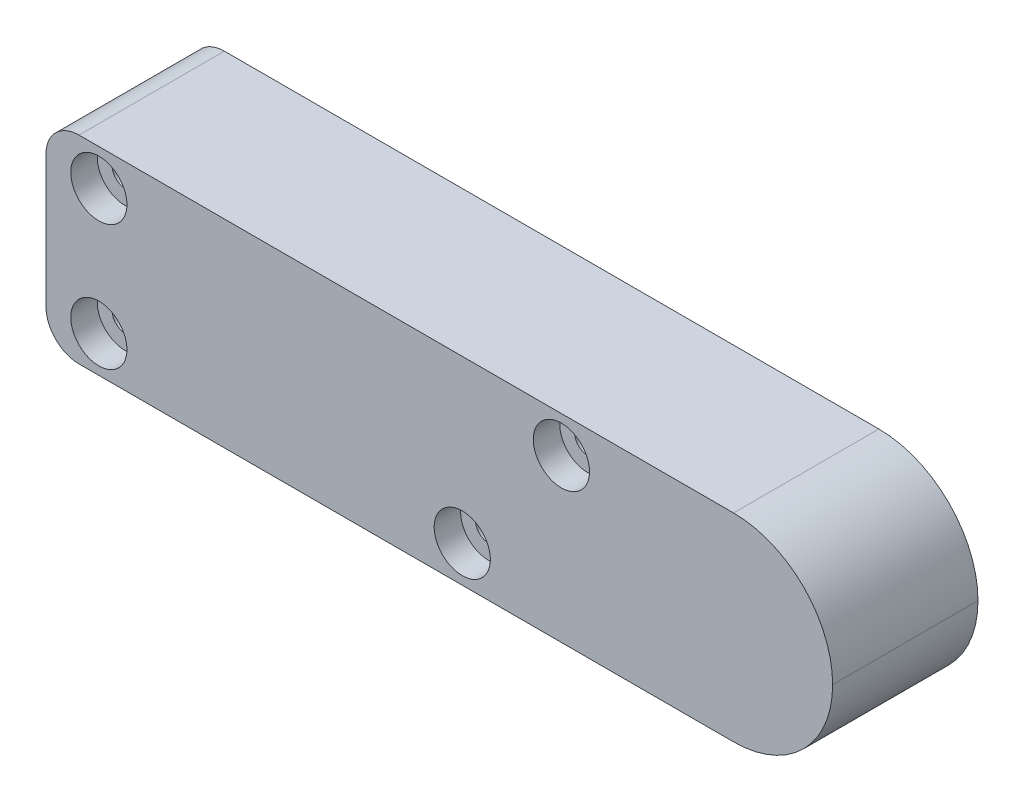
ISO-10303-21;
HEADER;
FILE_DESCRIPTION(('STEP AP214'),'2;1');
FILE_NAME('part.step','',(''),(''),'','','');
FILE_SCHEMA(('AUTOMOTIVE_DESIGN { 1 0 10303 214 1 1 1 1 }'));
ENDSEC;
DATA;
#1=APPLICATION_CONTEXT('core data for automotive mechanical design processes');
#2=APPLICATION_PROTOCOL_DEFINITION('international standard','automotive_design',2000,#1);
#3=PRODUCT_CONTEXT('',#1,'mechanical');
#4=PRODUCT('Part','Part','',(#3));
#5=PRODUCT_RELATED_PRODUCT_CATEGORY('part','',(#4));
#6=PRODUCT_DEFINITION_FORMATION('','',#4);
#7=PRODUCT_DEFINITION_CONTEXT('part definition',#1,'design');
#8=PRODUCT_DEFINITION('design','',#6,#7);
#9=PRODUCT_DEFINITION_SHAPE('','',#8);
#10=(LENGTH_UNIT() NAMED_UNIT(*) SI_UNIT(.MILLI.,.METRE.));
#11=(NAMED_UNIT(*) PLANE_ANGLE_UNIT() SI_UNIT($,.RADIAN.));
#12=(NAMED_UNIT(*) SI_UNIT($,.STERADIAN.) SOLID_ANGLE_UNIT());
#13=UNCERTAINTY_MEASURE_WITH_UNIT(LENGTH_MEASURE(1.E-05),#10,'distance_accuracy_value','');
#14=(GEOMETRIC_REPRESENTATION_CONTEXT(3) GLOBAL_UNCERTAINTY_ASSIGNED_CONTEXT((#13)) GLOBAL_UNIT_ASSIGNED_CONTEXT((#10,
#11,#12)) REPRESENTATION_CONTEXT('',''));
#15=CARTESIAN_POINT('',(0.,0.,0.));
#16=DIRECTION('',(0.,0.,1.));
#17=DIRECTION('',(1.,0.,0.));
#18=AXIS2_PLACEMENT_3D('',#15,#16,#17);
#19=CARTESIAN_POINT('',(-6.99999999999998,-6.93369842754066,41.));
#20=DIRECTION('',(0.,0.,-1.));
#21=DIRECTION('',(-1.,0.,0.));
#22=AXIS2_PLACEMENT_3D('',#19,#20,#21);
#23=CYLINDRICAL_SURFACE('',#22,2.);
#24=CARTESIAN_POINT('',(-6.99999999999998,-6.93369842754066,16.));
#25=DIRECTION('',(0.,0.,-1.));
#26=DIRECTION('',(-1.,0.,0.));
#27=AXIS2_PLACEMENT_3D('',#24,#25,#26);
#28=CIRCLE('',#27,2.);
#29=CARTESIAN_POINT('',(-8.99999999999998,-6.93369842754066,16.));
#30=VERTEX_POINT('',#29);
#31=EDGE_CURVE('E223',#30,#30,#28,.T.);
#32=ORIENTED_EDGE('',*,*,#31,.T.);
#33=EDGE_LOOP('',(#32));
#34=FACE_BOUND('',#33,.T.);
#35=CARTESIAN_POINT('',(-6.99999999999998,-6.93369842754066,34.));
#36=DIRECTION('',(0.,0.,1.));
#37=DIRECTION('',(1.,0.,0.));
#38=AXIS2_PLACEMENT_3D('',#35,#36,#37);
#39=CIRCLE('',#38,2.);
#40=CARTESIAN_POINT('',(-4.99999999999998,-6.93369842754066,34.));
#41=VERTEX_POINT('',#40);
#42=EDGE_CURVE('E235',#41,#41,#39,.F.);
#43=ORIENTED_EDGE('',*,*,#42,.F.);
#44=EDGE_LOOP('',(#43));
#45=FACE_BOUND('',#44,.T.);
#46=ADVANCED_FACE('F36',(#34,#45),#23,.F.);
#47=CARTESIAN_POINT('',(8.00000000000004,12.07,41.));
#48=DIRECTION('',(0.,0.,-1.));
#49=DIRECTION('',(-1.,0.,0.));
#50=AXIS2_PLACEMENT_3D('',#47,#48,#49);
#51=CYLINDRICAL_SURFACE('',#50,2.);
#52=CARTESIAN_POINT('',(8.00000000000004,12.07,16.));
#53=DIRECTION('',(0.,0.,-1.));
#54=DIRECTION('',(-1.,0.,0.));
#55=AXIS2_PLACEMENT_3D('',#52,#53,#54);
#56=CIRCLE('',#55,2.);
#57=CARTESIAN_POINT('',(6.00000000000003,12.07,16.));
#58=VERTEX_POINT('',#57);
#59=EDGE_CURVE('E275',#58,#58,#56,.T.);
#60=ORIENTED_EDGE('',*,*,#59,.T.);
#61=EDGE_LOOP('',(#60));
#62=FACE_BOUND('',#61,.T.);
#63=CARTESIAN_POINT('',(8.00000000000004,12.07,34.));
#64=DIRECTION('',(0.,0.,1.));
#65=DIRECTION('',(1.,0.,0.));
#66=AXIS2_PLACEMENT_3D('',#63,#64,#65);
#67=CIRCLE('',#66,2.);
#68=CARTESIAN_POINT('',(10.,12.07,34.));
#69=VERTEX_POINT('',#68);
#70=EDGE_CURVE('E230',#69,#69,#67,.F.);
#71=ORIENTED_EDGE('',*,*,#70,.F.);
#72=EDGE_LOOP('',(#71));
#73=FACE_BOUND('',#72,.T.);
#74=ADVANCED_FACE('F377',(#62,#73),#51,.F.);
#75=CARTESIAN_POINT('',(-62.,-6.93369842754066,41.));
#76=DIRECTION('',(0.,0.,-1.));
#77=DIRECTION('',(-1.,0.,0.));
#78=AXIS2_PLACEMENT_3D('',#75,#76,#77);
#79=CYLINDRICAL_SURFACE('',#78,2.);
#80=CARTESIAN_POINT('',(-62.,-6.93369842754066,16.));
#81=DIRECTION('',(0.,0.,-1.));
#82=DIRECTION('',(-1.,0.,0.));
#83=AXIS2_PLACEMENT_3D('',#80,#81,#82);
#84=CIRCLE('',#83,2.);
#85=CARTESIAN_POINT('',(-64.,-6.93369842754066,16.));
#86=VERTEX_POINT('',#85);
#87=EDGE_CURVE('E733',#86,#86,#84,.T.);
#88=ORIENTED_EDGE('',*,*,#87,.T.);
#89=EDGE_LOOP('',(#88));
#90=FACE_BOUND('',#89,.T.);
#91=CARTESIAN_POINT('',(-62.,-6.93369842754066,34.));
#92=DIRECTION('',(0.,0.,1.));
#93=DIRECTION('',(1.,0.,0.));
#94=AXIS2_PLACEMENT_3D('',#91,#92,#93);
#95=CIRCLE('',#94,2.);
#96=CARTESIAN_POINT('',(-60.,-6.93369842754066,34.));
#97=VERTEX_POINT('',#96);
#98=EDGE_CURVE('E225',#97,#97,#95,.F.);
#99=ORIENTED_EDGE('',*,*,#98,.F.);
#100=EDGE_LOOP('',(#99));
#101=FACE_BOUND('',#100,.T.);
#102=ADVANCED_FACE('F383',(#90,#101),#79,.F.);
#103=CARTESIAN_POINT('',(-62.,12.07,41.));
#104=DIRECTION('',(0.,0.,-1.));
#105=DIRECTION('',(-1.,0.,0.));
#106=AXIS2_PLACEMENT_3D('',#103,#104,#105);
#107=CYLINDRICAL_SURFACE('',#106,2.);
#108=CARTESIAN_POINT('',(-62.,12.07,16.));
#109=DIRECTION('',(0.,0.,-1.));
#110=DIRECTION('',(-1.,0.,0.));
#111=AXIS2_PLACEMENT_3D('',#108,#109,#110);
#112=CIRCLE('',#111,2.);
#113=CARTESIAN_POINT('',(-64.,12.07,16.));
#114=VERTEX_POINT('',#113);
#115=EDGE_CURVE('E272',#114,#114,#112,.T.);
#116=ORIENTED_EDGE('',*,*,#115,.T.);
#117=EDGE_LOOP('',(#116));
#118=FACE_BOUND('',#117,.T.);
#119=CARTESIAN_POINT('',(-62.,12.07,34.));
#120=DIRECTION('',(0.,0.,1.));
#121=DIRECTION('',(1.,0.,0.));
#122=AXIS2_PLACEMENT_3D('',#119,#120,#121);
#123=CIRCLE('',#122,2.);
#124=CARTESIAN_POINT('',(-60.,12.07,34.));
#125=VERTEX_POINT('',#124);
#126=EDGE_CURVE('E220',#125,#125,#123,.F.);
#127=ORIENTED_EDGE('',*,*,#126,.F.);
#128=EDGE_LOOP('',(#127));
#129=FACE_BOUND('',#128,.T.);
#130=ADVANCED_FACE('F350',(#118,#129),#107,.F.);
#131=CARTESIAN_POINT('',(-70.,-20.,35.));
#132=DIRECTION('',(1.,0.,0.));
#133=DIRECTION('',(0.,0.,-1.));
#134=AXIS2_PLACEMENT_3D('',#131,#132,#133);
#135=PLANE('',#134);
#136=DIRECTION('',(0.,-1.,0.));
#137=VECTOR('',#136,1.);
#138=CARTESIAN_POINT('',(-70.,20.,38.));
#139=LINE('',#138,#137);
#140=CARTESIAN_POINT('',(-70.,12.57,38.));
#141=VERTEX_POINT('',#140);
#142=CARTESIAN_POINT('',(-70.,-7.43369842754066,38.));
#143=VERTEX_POINT('',#142);
#144=EDGE_CURVE('E253',#141,#143,#139,.T.);
#145=ORIENTED_EDGE('',*,*,#144,.F.);
#146=DIRECTION('',(0.,0.,-1.));
#147=VECTOR('',#146,1.);
#148=CARTESIAN_POINT('',(-70.,12.57,35.));
#149=LINE('',#148,#147);
#150=CARTESIAN_POINT('',(-70.,12.57,16.));
#151=VERTEX_POINT('',#150);
#152=EDGE_CURVE('E242',#141,#151,#149,.T.);
#153=ORIENTED_EDGE('',*,*,#152,.T.);
#154=DIRECTION('',(0.,1.,0.));
#155=VECTOR('',#154,1.);
#156=CARTESIAN_POINT('',(-70.,-20.,16.));
#157=LINE('',#156,#155);
#158=CARTESIAN_POINT('',(-70.,-7.43369842754066,16.));
#159=VERTEX_POINT('',#158);
#160=EDGE_CURVE('E269',#159,#151,#157,.T.);
#161=ORIENTED_EDGE('',*,*,#160,.F.);
#162=DIRECTION('',(0.,0.,1.));
#163=VECTOR('',#162,1.);
#164=CARTESIAN_POINT('',(-70.,-7.43369842754066,35.));
#165=LINE('',#164,#163);
#166=EDGE_CURVE('E219',#159,#143,#165,.T.);
#167=ORIENTED_EDGE('',*,*,#166,.T.);
#168=EDGE_LOOP('',(#145,#153,#161,#167));
#169=FACE_BOUND('',#168,.T.);
#170=ADVANCED_FACE('F257',(#169),#135,.F.);
#171=CARTESIAN_POINT('',(-61.74271371787,-0.880933602132559,10.));
#172=CARTESIAN_POINT('',(-32.6636334906638,12.5455996530614,10.));
#173=CARTESIAN_POINT('',(-3.21353823021199,2.72288002919137,10.));
#174=B_SPLINE_CURVE_WITH_KNOTS('',2,(#171,#172,#173),.UNSPECIFIED.,.F.,.F.,(3,3),(0.,1.),.UNSPECIFIED.);
#175=DIRECTION('',(0.,0.,1.));
#176=VECTOR('',#175,1.);
#177=SURFACE_OF_LINEAR_EXTRUSION('',#174,#176);
#178=CARTESIAN_POINT('',(-61.74271371787,-0.880933602132559,35.));
#179=CARTESIAN_POINT('',(-32.6636334906638,12.5455996530614,35.));
#180=CARTESIAN_POINT('',(-3.21353823021199,2.72288002919137,35.));
#181=B_SPLINE_CURVE_WITH_KNOTS('',2,(#178,#179,#180),.UNSPECIFIED.,.F.,.F.,(3,3),(0.,1.),.UNSPECIFIED.);
#182=CARTESIAN_POINT('',(-61.74271371787,-0.88093360213256,35.));
#183=VERTEX_POINT('',#182);
#184=CARTESIAN_POINT('',(-3.69631832876691,2.88235161278144,35.));
#185=VERTEX_POINT('',#184);
#186=EDGE_CURVE('E324',#183,#185,#181,.T.);
#187=ORIENTED_EDGE('',*,*,#186,.T.);
#188=DIRECTION('',(0.,0.,1.));
#189=VECTOR('',#188,1.);
#190=CARTESIAN_POINT('',(-3.69631832876691,2.88235161278144,35.));
#191=LINE('',#190,#189);
#192=CARTESIAN_POINT('',(-3.69631832876691,2.88235161278144,16.));
#193=VERTEX_POINT('',#192);
#194=EDGE_CURVE('E186',#185,#193,#191,.F.);
#195=ORIENTED_EDGE('',*,*,#194,.T.);
#196=CARTESIAN_POINT('',(-61.74271371787,-0.880933602132559,16.));
#197=CARTESIAN_POINT('',(-32.6636334906638,12.5455996530614,16.));
#198=CARTESIAN_POINT('',(-3.21353823021199,2.72288002919137,16.));
#199=B_SPLINE_CURVE_WITH_KNOTS('',2,(#196,#197,#198),.UNSPECIFIED.,.F.,.F.,(3,3),(0.,1.),.UNSPECIFIED.);
#200=CARTESIAN_POINT('',(-61.74271371787,-0.88093360213256,16.));
#201=VERTEX_POINT('',#200);
#202=EDGE_CURVE('E319',#201,#193,#199,.T.);
#203=ORIENTED_EDGE('',*,*,#202,.F.);
#204=DIRECTION('',(0.,0.,1.));
#205=VECTOR('',#204,1.);
#206=CARTESIAN_POINT('',(-61.74271371787,-0.88093360213256,10.));
#207=LINE('',#206,#205);
#208=EDGE_CURVE('E471',#201,#183,#207,.T.);
#209=ORIENTED_EDGE('',*,*,#208,.T.);
#210=EDGE_LOOP('',(#187,#195,#203,#209));
#211=FACE_BOUND('',#210,.T.);
#212=ADVANCED_FACE('F340',(#211),#177,.F.);
#213=CARTESIAN_POINT('',(-62.8625417760023,0.939701665996412,10.));
#214=DIRECTION('',(0.,0.,1.));
#215=DIRECTION('',(1.,0.,0.));
#216=AXIS2_PLACEMENT_3D('',#213,#214,#215);
#217=CYLINDRICAL_SURFACE('',#216,2.13745822399768);
#218=ORIENTED_EDGE('',*,*,#208,.F.);
#219=CARTESIAN_POINT('',(-62.8625417760023,0.939701665996412,16.));
#220=DIRECTION('',(0.,0.,-1.));
#221=DIRECTION('',(-1.,0.,0.));
#222=AXIS2_PLACEMENT_3D('',#219,#220,#221);
#223=CIRCLE('',#222,2.13745822399768);
#224=CARTESIAN_POINT('',(-65.,0.939701665996412,16.));
#225=VERTEX_POINT('',#224);
#226=EDGE_CURVE('E316',#201,#225,#223,.T.);
#227=ORIENTED_EDGE('',*,*,#226,.T.);
#228=DIRECTION('',(0.,0.,1.));
#229=VECTOR('',#228,1.);
#230=CARTESIAN_POINT('',(-65.,0.939701665996412,10.));
#231=LINE('',#230,#229);
#232=CARTESIAN_POINT('',(-65.,0.939701665996412,35.));
#233=VERTEX_POINT('',#232);
#234=EDGE_CURVE('E473',#225,#233,#231,.T.);
#235=ORIENTED_EDGE('',*,*,#234,.T.);
#236=CARTESIAN_POINT('',(-62.8625417760023,0.939701665996412,35.));
#237=DIRECTION('',(0.,0.,1.));
#238=DIRECTION('',(1.,0.,0.));
#239=AXIS2_PLACEMENT_3D('',#236,#237,#238);
#240=CIRCLE('',#239,2.13745822399768);
#241=EDGE_CURVE('E468',#183,#233,#240,.F.);
#242=ORIENTED_EDGE('',*,*,#241,.F.);
#243=EDGE_LOOP('',(#218,#227,#235,#242));
#244=FACE_BOUND('',#243,.T.);
#245=ADVANCED_FACE('F344',(#244),#217,.F.);
#246=CARTESIAN_POINT('',(-65.,6.33697436120582E-13,10.));
#247=DIRECTION('',(1.,0.,0.));
#248=DIRECTION('',(0.,1.,0.));
#249=AXIS2_PLACEMENT_3D('',#246,#247,#248);
#250=PLANE('',#249);
#251=ORIENTED_EDGE('',*,*,#234,.F.);
#252=DIRECTION('',(0.,1.,0.));
#253=VECTOR('',#252,1.);
#254=CARTESIAN_POINT('',(-65.,6.33697436120582E-13,16.));
#255=LINE('',#254,#253);
#256=CARTESIAN_POINT('',(-64.9999999999993,2.36318258305711,16.));
#257=VERTEX_POINT('',#256);
#258=EDGE_CURVE('E313',#225,#257,#255,.T.);
#259=ORIENTED_EDGE('',*,*,#258,.T.);
#260=DIRECTION('',(0.,0.,1.));
#261=VECTOR('',#260,1.);
#262=CARTESIAN_POINT('',(-65.,2.36318258305711,10.));
#263=LINE('',#262,#261);
#264=CARTESIAN_POINT('',(-65.,2.36318258305711,35.));
#265=VERTEX_POINT('',#264);
#266=EDGE_CURVE('E475',#257,#265,#263,.T.);
#267=ORIENTED_EDGE('',*,*,#266,.T.);
#268=DIRECTION('',(0.,1.,0.));
#269=VECTOR('',#268,1.);
#270=CARTESIAN_POINT('',(-65.,6.33697436120582E-13,35.));
#271=LINE('',#270,#269);
#272=EDGE_CURVE('E465',#233,#265,#271,.T.);
#273=ORIENTED_EDGE('',*,*,#272,.F.);
#274=EDGE_LOOP('',(#251,#259,#267,#273));
#275=FACE_BOUND('',#274,.T.);
#276=ADVANCED_FACE('F417',(#275),#250,.T.);
#277=CARTESIAN_POINT('',(-59.999999999998,2.36318258305711,10.));
#278=DIRECTION('',(0.,0.,1.));
#279=DIRECTION('',(1.,0.,0.));
#280=AXIS2_PLACEMENT_3D('',#277,#278,#279);
#281=CYLINDRICAL_SURFACE('',#280,5.00000000000135);
#282=ORIENTED_EDGE('',*,*,#266,.F.);
#283=CARTESIAN_POINT('',(-59.999999999998,2.36318258305711,16.));
#284=DIRECTION('',(0.,0.,-1.));
#285=DIRECTION('',(-1.,0.,0.));
#286=AXIS2_PLACEMENT_3D('',#283,#284,#285);
#287=CIRCLE('',#286,5.00000000000135);
#288=CARTESIAN_POINT('',(-62.2254862607893,6.84059376621149,16.));
#289=VERTEX_POINT('',#288);
#290=EDGE_CURVE('E307',#257,#289,#287,.T.);
#291=ORIENTED_EDGE('',*,*,#290,.T.);
#292=DIRECTION('',(0.,0.,1.));
#293=VECTOR('',#292,1.);
#294=CARTESIAN_POINT('',(-62.2254862607896,6.8405937662121,10.));
#295=LINE('',#294,#293);
#296=CARTESIAN_POINT('',(-62.2254862607896,6.8405937662121,35.));
#297=VERTEX_POINT('',#296);
#298=EDGE_CURVE('E477',#289,#297,#295,.T.);
#299=ORIENTED_EDGE('',*,*,#298,.T.);
#300=CARTESIAN_POINT('',(-59.999999999998,2.36318258305711,35.));
#301=DIRECTION('',(0.,0.,1.));
#302=DIRECTION('',(1.,0.,0.));
#303=AXIS2_PLACEMENT_3D('',#300,#301,#302);
#304=CIRCLE('',#303,5.00000000000135);
#305=EDGE_CURVE('E460',#265,#297,#304,.F.);
#306=ORIENTED_EDGE('',*,*,#305,.F.);
#307=EDGE_LOOP('',(#282,#291,#299,#306));
#308=FACE_BOUND('',#307,.T.);
#309=ADVANCED_FACE('F421',(#308),#281,.F.);
#310=CARTESIAN_POINT('',(-65.4125422603224,5.0799444777887,10.));
#311=CARTESIAN_POINT('',(-64.6366210407416,5.55764647421509,10.));
#312=CARTESIAN_POINT('',(-63.3295020509311,6.29571799966948,10.));
#313=CARTESIAN_POINT('',(-60.9335870207585,7.48567797955336,10.));
#314=CARTESIAN_POINT('',(-56.7872580294598,9.27091368488656,10.));
#315=CARTESIAN_POINT('',(-50.2064140353374,11.3712568324939,10.));
#316=CARTESIAN_POINT('',(-41.4941584336822,13.2094041550009,10.));
#317=CARTESIAN_POINT('',(-32.6009653235692,14.2992332413665,10.));
#318=CARTESIAN_POINT('',(-23.9020538600208,14.6458002756998,10.));
#319=CARTESIAN_POINT('',(-15.4142627104443,14.0742795851284,10.));
#320=CARTESIAN_POINT('',(-7.27405135663202,12.3367420642671,10.));
#321=CARTESIAN_POINT('',(-2.14720505081484,10.1713442367808,10.));
#322=CARTESIAN_POINT('',(0.250220447481637,8.8063228385101,10.));
#323=B_SPLINE_CURVE_WITH_KNOTS('',3,(#310,#311,#312,#313,#314,#315,#316,#317,#318,#319,#320,
#321,#322),.UNSPECIFIED.,.F.,.F.,(4,1,1,1,1,1,1,1,1,1,4),(0.0700638837034009,0.105544545229762,
0.12919831958067,0.172962491612376,0.275861099521351,0.378759707430326,0.481658315339301,
0.584556923248275,0.68745553115725,0.790354139066225,0.8932527469752),.UNSPECIFIED.);
#324=DIRECTION('',(0.,0.,1.));
#325=VECTOR('',#324,1.);
#326=SURFACE_OF_LINEAR_EXTRUSION('',#323,#325);
#327=CARTESIAN_POINT('',(-65.4125422603224,5.0799444777887,16.));
#328=CARTESIAN_POINT('',(-64.6366210407416,5.55764647421509,16.));
#329=CARTESIAN_POINT('',(-63.3295020509311,6.29571799966948,16.));
#330=CARTESIAN_POINT('',(-60.9335870207585,7.48567797955336,16.));
#331=CARTESIAN_POINT('',(-56.7872580294598,9.27091368488656,16.));
#332=CARTESIAN_POINT('',(-50.2064140353374,11.3712568324939,16.));
#333=CARTESIAN_POINT('',(-41.4941584336822,13.2094041550009,16.));
#334=CARTESIAN_POINT('',(-32.6009653235692,14.2992332413665,16.));
#335=CARTESIAN_POINT('',(-23.9020538600208,14.6458002756998,16.));
#336=CARTESIAN_POINT('',(-15.4142627104443,14.0742795851284,16.));
#337=CARTESIAN_POINT('',(-7.27405135663202,12.3367420642671,16.));
#338=CARTESIAN_POINT('',(-2.14720505081484,10.1713442367808,16.));
#339=CARTESIAN_POINT('',(0.250220447481637,8.8063228385101,16.));
#340=B_SPLINE_CURVE_WITH_KNOTS('',3,(#327,#328,#329,#330,#331,#332,#333,#334,#335,#336,#337,
#338,#339),.UNSPECIFIED.,.F.,.F.,(4,1,1,1,1,1,1,1,1,1,4),(0.0700638837034009,0.105544545229762,
0.12919831958067,0.172962491612376,0.275861099521351,0.378759707430326,0.481658315339301,
0.584556923248275,0.68745553115725,0.790354139066225,0.8932527469752),.UNSPECIFIED.);
#341=CARTESIAN_POINT('',(-1.68096742796234,9.82865372580348,16.));
#342=VERTEX_POINT('',#341);
#343=EDGE_CURVE('E299',#289,#342,#340,.T.);
#344=ORIENTED_EDGE('',*,*,#343,.T.);
#345=DIRECTION('',(0.,0.,1.));
#346=VECTOR('',#345,1.);
#347=CARTESIAN_POINT('',(-1.68096742796234,9.82865372580348,16.));
#348=LINE('',#347,#346);
#349=CARTESIAN_POINT('',(-1.68096742796234,9.82865372580348,35.));
#350=VERTEX_POINT('',#349);
#351=EDGE_CURVE('E165',#342,#350,#348,.T.);
#352=ORIENTED_EDGE('',*,*,#351,.T.);
#353=CARTESIAN_POINT('',(-65.4125422603224,5.0799444777887,35.));
#354=CARTESIAN_POINT('',(-64.6366210407416,5.55764647421509,35.));
#355=CARTESIAN_POINT('',(-63.3295020509311,6.29571799966948,35.));
#356=CARTESIAN_POINT('',(-60.9335870207585,7.48567797955336,35.));
#357=CARTESIAN_POINT('',(-56.7872580294598,9.27091368488656,35.));
#358=CARTESIAN_POINT('',(-50.2064140353374,11.3712568324939,35.));
#359=CARTESIAN_POINT('',(-41.4941584336822,13.2094041550009,35.));
#360=CARTESIAN_POINT('',(-32.6009653235692,14.2992332413665,35.));
#361=CARTESIAN_POINT('',(-23.9020538600208,14.6458002756998,35.));
#362=CARTESIAN_POINT('',(-15.4142627104443,14.0742795851284,35.));
#363=CARTESIAN_POINT('',(-7.27405135663202,12.3367420642671,35.));
#364=CARTESIAN_POINT('',(-2.14720505081484,10.1713442367808,35.));
#365=CARTESIAN_POINT('',(0.250220447481637,8.8063228385101,35.));
#366=B_SPLINE_CURVE_WITH_KNOTS('',3,(#353,#354,#355,#356,#357,#358,#359,#360,#361,#362,#363,
#364,#365),.UNSPECIFIED.,.F.,.F.,(4,1,1,1,1,1,1,1,1,1,4),(0.0700638837034009,0.105544545229762,
0.12919831958067,0.172962491612376,0.275861099521351,0.378759707430326,0.481658315339301,
0.584556923248275,0.68745553115725,0.790354139066225,0.8932527469752),.UNSPECIFIED.);
#367=EDGE_CURVE('E175',#297,#350,#366,.T.);
#368=ORIENTED_EDGE('',*,*,#367,.F.);
#369=ORIENTED_EDGE('',*,*,#298,.F.);
#370=EDGE_LOOP('',(#344,#352,#368,#369));
#371=FACE_BOUND('',#370,.T.);
#372=ADVANCED_FACE('F425',(#371),#326,.T.);
#373=CARTESIAN_POINT('',(-1.26522695285752,9.62108272792494,10.));
#374=CARTESIAN_POINT('',(5.31996116719572,7.82651153648817,10.));
#375=CARTESIAN_POINT('',(19.0726499841017,4.27393177216222,10.));
#376=CARTESIAN_POINT('',(30.1167735630729,18.6804204916407,10.));
#377=CARTESIAN_POINT('',(50.1410318733671,7.90316310721597,10.));
#378=CARTESIAN_POINT('',(40.1523840382313,-8.70004695595579,10.));
#379=CARTESIAN_POINT('',(32.9744587781977,-10.3107890552842,10.));
#380=B_SPLINE_CURVE_WITH_KNOTS('',3,(#373,#374,#375,#376,#377,#378,#379),.UNSPECIFIED.,.F.,.F.,
(4,1,1,1,4),(0.,0.327114298523855,0.472643012607937,0.672292195713508,1.),.UNSPECIFIED.);
#381=DIRECTION('',(0.,0.,1.));
#382=VECTOR('',#381,1.);
#383=SURFACE_OF_LINEAR_EXTRUSION('',#380,#382);
#384=CARTESIAN_POINT('',(-1.26522695285752,9.62108272792494,35.));
#385=CARTESIAN_POINT('',(5.31996116719572,7.82651153648817,35.));
#386=CARTESIAN_POINT('',(19.0726499841017,4.27393177216222,35.));
#387=CARTESIAN_POINT('',(30.1167735630729,18.6804204916407,35.));
#388=CARTESIAN_POINT('',(50.1410318733671,7.90316310721597,35.));
#389=CARTESIAN_POINT('',(40.1523840382313,-8.70004695595579,35.));
#390=CARTESIAN_POINT('',(32.9744587781977,-10.3107890552842,35.));
#391=B_SPLINE_CURVE_WITH_KNOTS('',3,(#384,#385,#386,#387,#388,#389,#390),.UNSPECIFIED.,.F.,.F.,
(4,1,1,1,4),(0.,0.327114298523855,0.472643012607937,0.672292195713508,1.),.UNSPECIFIED.);
#392=CARTESIAN_POINT('',(-0.783783607090096,9.49019635995783,35.));
#393=VERTEX_POINT('',#392);
#394=CARTESIAN_POINT('',(32.9744587781977,-10.3107890552842,35.));
#395=VERTEX_POINT('',#394);
#396=EDGE_CURVE('E169',#393,#395,#391,.T.);
#397=ORIENTED_EDGE('',*,*,#396,.F.);
#398=DIRECTION('',(0.,0.,1.));
#399=VECTOR('',#398,1.);
#400=CARTESIAN_POINT('',(-0.783783607103783,9.49019635996154,35.));
#401=LINE('',#400,#399);
#402=CARTESIAN_POINT('',(-0.783783607090096,9.49019635995783,16.));
#403=VERTEX_POINT('',#402);
#404=EDGE_CURVE('E154',#393,#403,#401,.F.);
#405=ORIENTED_EDGE('',*,*,#404,.T.);
#406=CARTESIAN_POINT('',(-1.26522695285752,9.62108272792494,16.));
#407=CARTESIAN_POINT('',(5.31996116719572,7.82651153648817,16.));
#408=CARTESIAN_POINT('',(19.0726499841017,4.27393177216222,16.));
#409=CARTESIAN_POINT('',(30.1167735630729,18.6804204916407,16.));
#410=CARTESIAN_POINT('',(50.1410318733671,7.90316310721597,16.));
#411=CARTESIAN_POINT('',(40.1523840382313,-8.70004695595579,16.));
#412=CARTESIAN_POINT('',(32.9744587781977,-10.3107890552842,16.));
#413=B_SPLINE_CURVE_WITH_KNOTS('',3,(#406,#407,#408,#409,#410,#411,#412),.UNSPECIFIED.,.F.,.F.,
(4,1,1,1,4),(0.,0.327114298523855,0.472643012607937,0.672292195713508,1.),.UNSPECIFIED.);
#414=CARTESIAN_POINT('',(32.9744587781977,-10.3107890552842,16.));
#415=VERTEX_POINT('',#414);
#416=EDGE_CURVE('E292',#403,#415,#413,.T.);
#417=ORIENTED_EDGE('',*,*,#416,.T.);
#418=DIRECTION('',(0.,0.,1.));
#419=VECTOR('',#418,1.);
#420=CARTESIAN_POINT('',(32.9744587781977,-10.3107890552842,10.));
#421=LINE('',#420,#419);
#422=EDGE_CURVE('E172',#415,#395,#421,.T.);
#423=ORIENTED_EDGE('',*,*,#422,.T.);
#424=EDGE_LOOP('',(#397,#405,#417,#423));
#425=FACE_BOUND('',#424,.T.);
#426=ADVANCED_FACE('F170',(#425),#383,.T.);
#427=CARTESIAN_POINT('',(-3.213538230212,2.72288002919138,10.));
#428=CARTESIAN_POINT('',(7.77899157711303,-3.48673698105218,10.));
#429=CARTESIAN_POINT('',(19.5217630952349,-12.0750381050668,10.));
#430=CARTESIAN_POINT('',(32.9744587781977,-10.3107890552842,10.));
#431=B_SPLINE_CURVE_WITH_KNOTS('',3,(#427,#428,#429,#430),.UNSPECIFIED.,.F.,.F.,(4,4),(0.,1.),.UNSPECIFIED.);
#432=DIRECTION('',(0.,0.,1.));
#433=VECTOR('',#432,1.);
#434=SURFACE_OF_LINEAR_EXTRUSION('',#431,#433);
#435=CARTESIAN_POINT('',(-3.213538230212,2.72288002919138,16.));
#436=CARTESIAN_POINT('',(7.77899157711303,-3.48673698105218,16.));
#437=CARTESIAN_POINT('',(19.5217630952349,-12.0750381050668,16.));
#438=CARTESIAN_POINT('',(32.9744587781977,-10.3107890552842,16.));
#439=B_SPLINE_CURVE_WITH_KNOTS('',3,(#435,#436,#437,#438),.UNSPECIFIED.,.F.,.F.,(4,4),(0.,1.),.UNSPECIFIED.);
#440=CARTESIAN_POINT('',(-2.77678970668526,2.47516726404142,16.));
#441=VERTEX_POINT('',#440);
#442=EDGE_CURVE('E287',#441,#415,#439,.T.);
#443=ORIENTED_EDGE('',*,*,#442,.F.);
#444=DIRECTION('',(0.,0.,1.));
#445=VECTOR('',#444,1.);
#446=CARTESIAN_POINT('',(-2.77678970668526,2.47516726404142,16.));
#447=LINE('',#446,#445);
#448=CARTESIAN_POINT('',(-2.77678970668526,2.47516726404142,35.));
#449=VERTEX_POINT('',#448);
#450=EDGE_CURVE('E183',#441,#449,#447,.T.);
#451=ORIENTED_EDGE('',*,*,#450,.T.);
#452=CARTESIAN_POINT('',(-3.213538230212,2.72288002919138,35.));
#453=CARTESIAN_POINT('',(7.77899157711303,-3.48673698105218,35.));
#454=CARTESIAN_POINT('',(19.5217630952349,-12.0750381050668,35.));
#455=CARTESIAN_POINT('',(32.9744587781977,-10.3107890552842,35.));
#456=B_SPLINE_CURVE_WITH_KNOTS('',3,(#452,#453,#454,#455),.UNSPECIFIED.,.F.,.F.,(4,4),(0.,1.),.UNSPECIFIED.);
#457=EDGE_CURVE('E176',#449,#395,#456,.T.);
#458=ORIENTED_EDGE('',*,*,#457,.T.);
#459=ORIENTED_EDGE('',*,*,#422,.F.);
#460=EDGE_LOOP('',(#443,#451,#458,#459));
#461=FACE_BOUND('',#460,.T.);
#462=ADVANCED_FACE('F346',(#461),#434,.F.);
#463=CARTESIAN_POINT('',(49.0535411922696,20.,-15.));
#464=DIRECTION('',(-1.,0.,0.));
#465=DIRECTION('',(0.,0.,1.));
#466=AXIS2_PLACEMENT_3D('',#463,#464,#465);
#467=PLANE('',#466);
#468=DIRECTION('',(0.,1.,0.));
#469=VECTOR('',#468,1.);
#470=CARTESIAN_POINT('',(49.0535411922696,20.,38.));
#471=LINE('',#470,#469);
#472=CARTESIAN_POINT('',(49.0535411922696,2.56630157245934,38.));
#473=VERTEX_POINT('',#472);
#474=CARTESIAN_POINT('',(49.0535411922696,2.57,38.));
#475=VERTEX_POINT('',#474);
#476=EDGE_CURVE('E280',#473,#475,#471,.T.);
#477=ORIENTED_EDGE('',*,*,#476,.F.);
#478=DIRECTION('',(0.,0.,1.));
#479=VECTOR('',#478,1.);
#480=CARTESIAN_POINT('',(49.0535411922696,2.56630157245934,-15.));
#481=LINE('',#480,#479);
#482=CARTESIAN_POINT('',(49.0535411922696,2.56630157245934,16.));
#483=VERTEX_POINT('',#482);
#484=EDGE_CURVE('E209',#473,#483,#481,.F.);
#485=ORIENTED_EDGE('',*,*,#484,.T.);
#486=DIRECTION('',(0.,-1.,0.));
#487=VECTOR('',#486,1.);
#488=CARTESIAN_POINT('',(49.0535411922696,20.,16.));
#489=LINE('',#488,#487);
#490=CARTESIAN_POINT('',(49.0535411922696,2.57,16.));
#491=VERTEX_POINT('',#490);
#492=EDGE_CURVE('E283',#491,#483,#489,.T.);
#493=ORIENTED_EDGE('',*,*,#492,.F.);
#494=DIRECTION('',(0.,0.,-1.));
#495=VECTOR('',#494,1.);
#496=CARTESIAN_POINT('',(49.0535411922696,2.57,-15.));
#497=LINE('',#496,#495);
#498=EDGE_CURVE('E207',#491,#475,#497,.F.);
#499=ORIENTED_EDGE('',*,*,#498,.T.);
#500=EDGE_LOOP('',(#477,#485,#493,#499));
#501=FACE_BOUND('',#500,.T.);
#502=ADVANCED_FACE('F410',(#501),#467,.F.);
#503=CARTESIAN_POINT('',(0.,0.,16.));
#504=DIRECTION('',(0.,0.,-1.));
#505=DIRECTION('',(-1.,0.,0.));
#506=AXIS2_PLACEMENT_3D('',#503,#504,#505);
#507=PLANE('',#506);
#508=ORIENTED_EDGE('',*,*,#31,.F.);
#509=EDGE_LOOP('',(#508));
#510=FACE_BOUND('',#509,.T.);
#511=ORIENTED_EDGE('',*,*,#87,.F.);
#512=EDGE_LOOP('',(#511));
#513=FACE_BOUND('',#512,.T.);
#514=ORIENTED_EDGE('',*,*,#59,.F.);
#515=EDGE_LOOP('',(#514));
#516=FACE_BOUND('',#515,.T.);
#517=ORIENTED_EDGE('',*,*,#115,.F.);
#518=EDGE_LOOP('',(#517));
#519=FACE_BOUND('',#518,.T.);
#520=ORIENTED_EDGE('',*,*,#160,.T.);
#521=CARTESIAN_POINT('',(-65.,12.57,16.));
#522=DIRECTION('',(0.,0.,-1.));
#523=DIRECTION('',(-1.,0.,0.));
#524=AXIS2_PLACEMENT_3D('',#521,#522,#523);
#525=CIRCLE('',#524,5.);
#526=CARTESIAN_POINT('',(-64.9999999999999,17.57,16.));
#527=VERTEX_POINT('',#526);
#528=EDGE_CURVE('E247',#151,#527,#525,.T.);
#529=ORIENTED_EDGE('',*,*,#528,.T.);
#530=DIRECTION('',(-1.,0.,0.));
#531=VECTOR('',#530,1.);
#532=CARTESIAN_POINT('',(49.0535411922696,17.57,16.));
#533=LINE('',#532,#531);
#534=CARTESIAN_POINT('',(34.0535411922696,17.57,16.));
#535=VERTEX_POINT('',#534);
#536=EDGE_CURVE('E262',#535,#527,#533,.T.);
#537=ORIENTED_EDGE('',*,*,#536,.F.);
#538=CARTESIAN_POINT('',(34.0535411922696,2.57,16.));
#539=DIRECTION('',(0.,0.,-1.));
#540=DIRECTION('',(-1.,0.,0.));
#541=AXIS2_PLACEMENT_3D('',#538,#539,#540);
#542=CIRCLE('',#541,15.);
#543=EDGE_CURVE('E211',#535,#491,#542,.T.);
#544=ORIENTED_EDGE('',*,*,#543,.T.);
#545=ORIENTED_EDGE('',*,*,#492,.T.);
#546=CARTESIAN_POINT('',(34.0535411922696,2.56630157245934,16.));
#547=DIRECTION('',(0.,0.,-1.));
#548=DIRECTION('',(-1.,0.,0.));
#549=AXIS2_PLACEMENT_3D('',#546,#547,#548);
#550=CIRCLE('',#549,15.);
#551=CARTESIAN_POINT('',(34.0535411922696,-12.4336984275407,16.));
#552=VERTEX_POINT('',#551);
#553=EDGE_CURVE('E213',#483,#552,#550,.T.);
#554=ORIENTED_EDGE('',*,*,#553,.T.);
#555=DIRECTION('',(1.,0.,0.));
#556=VECTOR('',#555,1.);
#557=CARTESIAN_POINT('',(0.,-12.4336984275407,16.));
#558=LINE('',#557,#556);
#559=CARTESIAN_POINT('',(-65.,-12.4336984275407,16.));
#560=VERTEX_POINT('',#559);
#561=EDGE_CURVE('E189',#560,#552,#558,.T.);
#562=ORIENTED_EDGE('',*,*,#561,.F.);
#563=CARTESIAN_POINT('',(-65.,-7.43369842754066,16.));
#564=DIRECTION('',(0.,0.,-1.));
#565=DIRECTION('',(-1.,0.,0.));
#566=AXIS2_PLACEMENT_3D('',#563,#564,#565);
#567=CIRCLE('',#566,5.);
#568=EDGE_CURVE('E245',#560,#159,#567,.T.);
#569=ORIENTED_EDGE('',*,*,#568,.T.);
#570=EDGE_LOOP('',(#520,#529,#537,#544,#545,#554,#562,#569));
#571=FACE_BOUND('',#570,.T.);
#572=ORIENTED_EDGE('',*,*,#202,.T.);
#573=CARTESIAN_POINT('',(-5.25077423356464,-1.86987595332264,16.));
#574=DIRECTION('',(0.,0.,-1.));
#575=DIRECTION('',(-1.,0.,0.));
#576=AXIS2_PLACEMENT_3D('',#573,#574,#575);
#577=CIRCLE('',#576,5.);
#578=EDGE_CURVE('E195',#193,#441,#577,.T.);
#579=ORIENTED_EDGE('',*,*,#578,.T.);
#580=ORIENTED_EDGE('',*,*,#442,.T.);
#581=ORIENTED_EDGE('',*,*,#416,.F.);
#582=CARTESIAN_POINT('',(0.524310167347586,14.3160528308112,16.));
#583=DIRECTION('',(0.,0.,-1.));
#584=DIRECTION('',(-1.,0.,0.));
#585=AXIS2_PLACEMENT_3D('',#582,#583,#584);
#586=CIRCLE('',#585,5.);
#587=EDGE_CURVE('E161',#403,#342,#586,.T.);
#588=ORIENTED_EDGE('',*,*,#587,.T.);
#589=ORIENTED_EDGE('',*,*,#343,.F.);
#590=ORIENTED_EDGE('',*,*,#290,.F.);
#591=ORIENTED_EDGE('',*,*,#258,.F.);
#592=ORIENTED_EDGE('',*,*,#226,.F.);
#593=EDGE_LOOP('',(#572,#579,#580,#581,#588,#589,#590,#591,#592));
#594=FACE_BOUND('',#593,.T.);
#595=ADVANCED_FACE('F267',(#510,#513,#516,#519,#571,#594),#507,.T.);
#596=CARTESIAN_POINT('',(-70.,-12.4336984275407,2.));
#597=DIRECTION('',(0.,1.,0.));
#598=DIRECTION('',(-1.,0.,0.));
#599=AXIS2_PLACEMENT_3D('',#596,#597,#598);
#600=PLANE('',#599);
#601=DIRECTION('',(1.,0.,0.));
#602=VECTOR('',#601,1.);
#603=CARTESIAN_POINT('',(-70.,-12.4336984275407,38.));
#604=LINE('',#603,#602);
#605=CARTESIAN_POINT('',(-65.,-12.4336984275407,38.));
#606=VERTEX_POINT('',#605);
#607=CARTESIAN_POINT('',(34.0535411922695,-12.4336984275407,38.));
#608=VERTEX_POINT('',#607);
#609=EDGE_CURVE('E261',#606,#608,#604,.T.);
#610=ORIENTED_EDGE('',*,*,#609,.F.);
#611=DIRECTION('',(0.,0.,1.));
#612=VECTOR('',#611,1.);
#613=CARTESIAN_POINT('',(-65.,-12.4336984275407,2.));
#614=LINE('',#613,#612);
#615=EDGE_CURVE('E11',#606,#560,#614,.F.);
#616=ORIENTED_EDGE('',*,*,#615,.T.);
#617=ORIENTED_EDGE('',*,*,#561,.T.);
#618=DIRECTION('',(0.,0.,1.));
#619=VECTOR('',#618,1.);
#620=CARTESIAN_POINT('',(34.0535411922696,-12.4336984275407,2.));
#621=LINE('',#620,#619);
#622=EDGE_CURVE('E199',#552,#608,#621,.T.);
#623=ORIENTED_EDGE('',*,*,#622,.T.);
#624=EDGE_LOOP('',(#610,#616,#617,#623));
#625=FACE_BOUND('',#624,.T.);
#626=ADVANCED_FACE('F354',(#625),#600,.F.);
#627=CARTESIAN_POINT('',(-5.25077423356464,-1.86987595332264,25.5));
#628=DIRECTION('',(0.,0.,1.));
#629=DIRECTION('',(1.,0.,0.));
#630=AXIS2_PLACEMENT_3D('',#627,#628,#629);
#631=CYLINDRICAL_SURFACE('',#630,5.);
#632=ORIENTED_EDGE('',*,*,#578,.F.);
#633=ORIENTED_EDGE('',*,*,#194,.F.);
#634=CARTESIAN_POINT('',(-5.25077423356464,-1.86987595332264,35.));
#635=DIRECTION('',(0.,0.,-1.));
#636=DIRECTION('',(-1.,0.,0.));
#637=AXIS2_PLACEMENT_3D('',#634,#635,#636);
#638=CIRCLE('',#637,5.);
#639=EDGE_CURVE('E182',#449,#185,#638,.F.);
#640=ORIENTED_EDGE('',*,*,#639,.F.);
#641=ORIENTED_EDGE('',*,*,#450,.F.);
#642=EDGE_LOOP('',(#632,#633,#640,#641));
#643=FACE_BOUND('',#642,.T.);
#644=ADVANCED_FACE('F351',(#643),#631,.T.);
#645=CARTESIAN_POINT('',(0.524310167347586,14.3160528308112,25.5));
#646=DIRECTION('',(0.,0.,1.));
#647=DIRECTION('',(1.,0.,0.));
#648=AXIS2_PLACEMENT_3D('',#645,#646,#647);
#649=CYLINDRICAL_SURFACE('',#648,5.);
#650=ORIENTED_EDGE('',*,*,#587,.F.);
#651=ORIENTED_EDGE('',*,*,#404,.F.);
#652=CARTESIAN_POINT('',(0.524310167347586,14.3160528308112,35.));
#653=DIRECTION('',(0.,0.,-1.));
#654=DIRECTION('',(-1.,0.,0.));
#655=AXIS2_PLACEMENT_3D('',#652,#653,#654);
#656=CIRCLE('',#655,5.);
#657=EDGE_CURVE('E159',#350,#393,#656,.F.);
#658=ORIENTED_EDGE('',*,*,#657,.F.);
#659=ORIENTED_EDGE('',*,*,#351,.F.);
#660=EDGE_LOOP('',(#650,#651,#658,#659));
#661=FACE_BOUND('',#660,.T.);
#662=ADVANCED_FACE('F156',(#661),#649,.T.);
#663=CARTESIAN_POINT('',(0.,0.,35.));
#664=DIRECTION('',(0.,0.,1.));
#665=DIRECTION('',(1.,0.,0.));
#666=AXIS2_PLACEMENT_3D('',#663,#664,#665);
#667=PLANE('',#666);
#668=ORIENTED_EDGE('',*,*,#396,.T.);
#669=ORIENTED_EDGE('',*,*,#457,.F.);
#670=ORIENTED_EDGE('',*,*,#639,.T.);
#671=ORIENTED_EDGE('',*,*,#186,.F.);
#672=ORIENTED_EDGE('',*,*,#241,.T.);
#673=ORIENTED_EDGE('',*,*,#272,.T.);
#674=ORIENTED_EDGE('',*,*,#305,.T.);
#675=ORIENTED_EDGE('',*,*,#367,.T.);
#676=ORIENTED_EDGE('',*,*,#657,.T.);
#677=EDGE_LOOP('',(#668,#669,#670,#671,#672,#673,#674,#675,#676));
#678=FACE_BOUND('',#677,.T.);
#679=ADVANCED_FACE('F179',(#678),#667,.F.);
#680=CARTESIAN_POINT('',(0.,0.,38.));
#681=DIRECTION('',(0.,0.,1.));
#682=DIRECTION('',(1.,0.,0.));
#683=AXIS2_PLACEMENT_3D('',#680,#681,#682);
#684=PLANE('',#683);
#685=CARTESIAN_POINT('',(-6.99999999999998,-6.93369842754066,38.));
#686=DIRECTION('',(0.,0.,1.));
#687=DIRECTION('',(1.,0.,0.));
#688=AXIS2_PLACEMENT_3D('',#685,#686,#687);
#689=CIRCLE('',#688,4.25);
#690=CARTESIAN_POINT('',(-2.74999999999998,-6.93369842754066,38.));
#691=VERTEX_POINT('',#690);
#692=EDGE_CURVE('E756',#691,#691,#689,.T.);
#693=ORIENTED_EDGE('',*,*,#692,.F.);
#694=EDGE_LOOP('',(#693));
#695=FACE_BOUND('',#694,.T.);
#696=CARTESIAN_POINT('',(8.00000000000004,12.07,38.));
#697=DIRECTION('',(0.,0.,1.));
#698=DIRECTION('',(1.,0.,0.));
#699=AXIS2_PLACEMENT_3D('',#696,#697,#698);
#700=CIRCLE('',#699,4.25);
#701=CARTESIAN_POINT('',(12.25,12.07,38.));
#702=VERTEX_POINT('',#701);
#703=EDGE_CURVE('E238',#702,#702,#700,.T.);
#704=ORIENTED_EDGE('',*,*,#703,.F.);
#705=EDGE_LOOP('',(#704));
#706=FACE_BOUND('',#705,.T.);
#707=CARTESIAN_POINT('',(-62.,-6.93369842754066,38.));
#708=DIRECTION('',(0.,0.,1.));
#709=DIRECTION('',(1.,0.,0.));
#710=AXIS2_PLACEMENT_3D('',#707,#708,#709);
#711=CIRCLE('',#710,4.25000000000001);
#712=CARTESIAN_POINT('',(-57.75,-6.93369842754066,38.));
#713=VERTEX_POINT('',#712);
#714=EDGE_CURVE('E233',#713,#713,#711,.T.);
#715=ORIENTED_EDGE('',*,*,#714,.F.);
#716=EDGE_LOOP('',(#715));
#717=FACE_BOUND('',#716,.T.);
#718=CARTESIAN_POINT('',(-62.,12.07,38.));
#719=DIRECTION('',(0.,0.,1.));
#720=DIRECTION('',(1.,0.,0.));
#721=AXIS2_PLACEMENT_3D('',#718,#719,#720);
#722=CIRCLE('',#721,4.25000000000001);
#723=CARTESIAN_POINT('',(-57.75,12.07,38.));
#724=VERTEX_POINT('',#723);
#725=EDGE_CURVE('E228',#724,#724,#722,.T.);
#726=ORIENTED_EDGE('',*,*,#725,.F.);
#727=EDGE_LOOP('',(#726));
#728=FACE_BOUND('',#727,.T.);
#729=DIRECTION('',(1.,0.,0.));
#730=VECTOR('',#729,1.);
#731=CARTESIAN_POINT('',(0.,17.57,38.));
#732=LINE('',#731,#730);
#733=CARTESIAN_POINT('',(-65.,17.57,38.));
#734=VERTEX_POINT('',#733);
#735=CARTESIAN_POINT('',(34.0535411922696,17.57,38.));
#736=VERTEX_POINT('',#735);
#737=EDGE_CURVE('E164',#734,#736,#732,.T.);
#738=ORIENTED_EDGE('',*,*,#737,.F.);
#739=CARTESIAN_POINT('',(-65.,12.57,38.));
#740=DIRECTION('',(0.,0.,1.));
#741=DIRECTION('',(1.,0.,0.));
#742=AXIS2_PLACEMENT_3D('',#739,#740,#741);
#743=CIRCLE('',#742,5.);
#744=EDGE_CURVE('E44',#734,#141,#743,.T.);
#745=ORIENTED_EDGE('',*,*,#744,.T.);
#746=ORIENTED_EDGE('',*,*,#144,.T.);
#747=CARTESIAN_POINT('',(-65.,-7.43369842754066,38.));
#748=DIRECTION('',(0.,0.,1.));
#749=DIRECTION('',(1.,0.,0.));
#750=AXIS2_PLACEMENT_3D('',#747,#748,#749);
#751=CIRCLE('',#750,5.);
#752=EDGE_CURVE('E51',#143,#606,#751,.T.);
#753=ORIENTED_EDGE('',*,*,#752,.T.);
#754=ORIENTED_EDGE('',*,*,#609,.T.);
#755=CARTESIAN_POINT('',(34.0535411922696,2.56630157245934,38.));
#756=DIRECTION('',(0.,0.,1.));
#757=DIRECTION('',(1.,0.,0.));
#758=AXIS2_PLACEMENT_3D('',#755,#756,#757);
#759=CIRCLE('',#758,15.);
#760=EDGE_CURVE('E205',#608,#473,#759,.T.);
#761=ORIENTED_EDGE('',*,*,#760,.T.);
#762=ORIENTED_EDGE('',*,*,#476,.T.);
#763=CARTESIAN_POINT('',(34.0535411922696,2.57,38.));
#764=DIRECTION('',(0.,0.,1.));
#765=DIRECTION('',(1.,0.,0.));
#766=AXIS2_PLACEMENT_3D('',#763,#764,#765);
#767=CIRCLE('',#766,15.);
#768=EDGE_CURVE('E202',#475,#736,#767,.T.);
#769=ORIENTED_EDGE('',*,*,#768,.T.);
#770=EDGE_LOOP('',(#738,#745,#746,#753,#754,#761,#762,#769));
#771=FACE_BOUND('',#770,.T.);
#772=ADVANCED_FACE('F252',(#695,#706,#717,#728,#771),#684,.T.);
#773=CARTESIAN_POINT('',(49.0535411922696,17.57,41.));
#774=DIRECTION('',(0.,-1.,0.));
#775=DIRECTION('',(0.,0.,-1.));
#776=AXIS2_PLACEMENT_3D('',#773,#774,#775);
#777=PLANE('',#776);
#778=ORIENTED_EDGE('',*,*,#536,.T.);
#779=DIRECTION('',(0.,0.,-1.));
#780=VECTOR('',#779,1.);
#781=CARTESIAN_POINT('',(-65.,17.57,41.));
#782=LINE('',#781,#780);
#783=EDGE_CURVE('E59',#527,#734,#782,.F.);
#784=ORIENTED_EDGE('',*,*,#783,.T.);
#785=ORIENTED_EDGE('',*,*,#737,.T.);
#786=DIRECTION('',(0.,0.,-1.));
#787=VECTOR('',#786,1.);
#788=CARTESIAN_POINT('',(34.0535411922696,17.57,41.));
#789=LINE('',#788,#787);
#790=EDGE_CURVE('E216',#736,#535,#789,.T.);
#791=ORIENTED_EDGE('',*,*,#790,.T.);
#792=EDGE_LOOP('',(#778,#784,#785,#791));
#793=FACE_BOUND('',#792,.T.);
#794=ADVANCED_FACE('F270',(#793),#777,.F.);
#795=CARTESIAN_POINT('',(34.0535411922696,2.56630157245934,2.));
#796=DIRECTION('',(0.,0.,1.));
#797=DIRECTION('',(1.,0.,0.));
#798=AXIS2_PLACEMENT_3D('',#795,#796,#797);
#799=CYLINDRICAL_SURFACE('',#798,15.);
#800=ORIENTED_EDGE('',*,*,#553,.F.);
#801=ORIENTED_EDGE('',*,*,#484,.F.);
#802=ORIENTED_EDGE('',*,*,#760,.F.);
#803=ORIENTED_EDGE('',*,*,#622,.F.);
#804=EDGE_LOOP('',(#800,#801,#802,#803));
#805=FACE_BOUND('',#804,.T.);
#806=ADVANCED_FACE('F358',(#805),#799,.T.);
#807=CARTESIAN_POINT('',(34.0535411922696,2.57,41.));
#808=DIRECTION('',(0.,0.,-1.));
#809=DIRECTION('',(-1.,0.,0.));
#810=AXIS2_PLACEMENT_3D('',#807,#808,#809);
#811=CYLINDRICAL_SURFACE('',#810,15.);
#812=ORIENTED_EDGE('',*,*,#768,.F.);
#813=ORIENTED_EDGE('',*,*,#498,.F.);
#814=ORIENTED_EDGE('',*,*,#543,.F.);
#815=ORIENTED_EDGE('',*,*,#790,.F.);
#816=EDGE_LOOP('',(#812,#813,#814,#815));
#817=FACE_BOUND('',#816,.T.);
#818=ADVANCED_FACE('F361',(#817),#811,.T.);
#819=CARTESIAN_POINT('',(-62.,12.07,34.));
#820=DIRECTION('',(0.,0.,1.));
#821=DIRECTION('',(1.,0.,0.));
#822=AXIS2_PLACEMENT_3D('',#819,#820,#821);
#823=PLANE('',#822);
#824=CARTESIAN_POINT('',(-62.,12.07,34.));
#825=DIRECTION('',(0.,0.,1.));
#826=DIRECTION('',(1.,0.,0.));
#827=AXIS2_PLACEMENT_3D('',#824,#825,#826);
#828=CIRCLE('',#827,4.25000000000001);
#829=CARTESIAN_POINT('',(-57.75,12.07,34.));
#830=VERTEX_POINT('',#829);
#831=EDGE_CURVE('E224',#830,#830,#828,.T.);
#832=ORIENTED_EDGE('',*,*,#831,.T.);
#833=EDGE_LOOP('',(#832));
#834=FACE_BOUND('',#833,.T.);
#835=ORIENTED_EDGE('',*,*,#126,.T.);
#836=EDGE_LOOP('',(#835));
#837=FACE_BOUND('',#836,.T.);
#838=ADVANCED_FACE('F364',(#834,#837),#823,.T.);
#839=CARTESIAN_POINT('',(-62.,12.07,34.));
#840=DIRECTION('',(0.,0.,1.));
#841=DIRECTION('',(1.,0.,0.));
#842=AXIS2_PLACEMENT_3D('',#839,#840,#841);
#843=CYLINDRICAL_SURFACE('',#842,4.25000000000001);
#844=ORIENTED_EDGE('',*,*,#831,.F.);
#845=EDGE_LOOP('',(#844));
#846=FACE_BOUND('',#845,.T.);
#847=ORIENTED_EDGE('',*,*,#725,.T.);
#848=EDGE_LOOP('',(#847));
#849=FACE_BOUND('',#848,.T.);
#850=ADVANCED_FACE('F390',(#846,#849),#843,.F.);
#851=CARTESIAN_POINT('',(-62.,-6.93369842754066,34.));
#852=DIRECTION('',(0.,0.,1.));
#853=DIRECTION('',(1.,0.,0.));
#854=AXIS2_PLACEMENT_3D('',#851,#852,#853);
#855=PLANE('',#854);
#856=CARTESIAN_POINT('',(-62.,-6.93369842754066,34.));
#857=DIRECTION('',(0.,0.,1.));
#858=DIRECTION('',(1.,0.,0.));
#859=AXIS2_PLACEMENT_3D('',#856,#857,#858);
#860=CIRCLE('',#859,4.25000000000001);
#861=CARTESIAN_POINT('',(-57.75,-6.93369842754066,34.));
#862=VERTEX_POINT('',#861);
#863=EDGE_CURVE('E229',#862,#862,#860,.T.);
#864=ORIENTED_EDGE('',*,*,#863,.T.);
#865=EDGE_LOOP('',(#864));
#866=FACE_BOUND('',#865,.T.);
#867=ORIENTED_EDGE('',*,*,#98,.T.);
#868=EDGE_LOOP('',(#867));
#869=FACE_BOUND('',#868,.T.);
#870=ADVANCED_FACE('F691',(#866,#869),#855,.T.);
#871=CARTESIAN_POINT('',(-62.,-6.93369842754066,34.));
#872=DIRECTION('',(0.,0.,1.));
#873=DIRECTION('',(1.,0.,0.));
#874=AXIS2_PLACEMENT_3D('',#871,#872,#873);
#875=CYLINDRICAL_SURFACE('',#874,4.25000000000001);
#876=ORIENTED_EDGE('',*,*,#863,.F.);
#877=EDGE_LOOP('',(#876));
#878=FACE_BOUND('',#877,.T.);
#879=ORIENTED_EDGE('',*,*,#714,.T.);
#880=EDGE_LOOP('',(#879));
#881=FACE_BOUND('',#880,.T.);
#882=ADVANCED_FACE('F682',(#878,#881),#875,.F.);
#883=CARTESIAN_POINT('',(8.00000000000004,12.07,34.));
#884=DIRECTION('',(0.,0.,1.));
#885=DIRECTION('',(1.,0.,0.));
#886=AXIS2_PLACEMENT_3D('',#883,#884,#885);
#887=PLANE('',#886);
#888=CARTESIAN_POINT('',(8.00000000000004,12.07,34.));
#889=DIRECTION('',(0.,0.,1.));
#890=DIRECTION('',(1.,0.,0.));
#891=AXIS2_PLACEMENT_3D('',#888,#889,#890);
#892=CIRCLE('',#891,4.25);
#893=CARTESIAN_POINT('',(12.25,12.07,34.));
#894=VERTEX_POINT('',#893);
#895=EDGE_CURVE('E234',#894,#894,#892,.T.);
#896=ORIENTED_EDGE('',*,*,#895,.T.);
#897=EDGE_LOOP('',(#896));
#898=FACE_BOUND('',#897,.T.);
#899=ORIENTED_EDGE('',*,*,#70,.T.);
#900=EDGE_LOOP('',(#899));
#901=FACE_BOUND('',#900,.T.);
#902=ADVANCED_FACE('F673',(#898,#901),#887,.T.);
#903=CARTESIAN_POINT('',(8.00000000000004,12.07,34.));
#904=DIRECTION('',(0.,0.,1.));
#905=DIRECTION('',(1.,0.,0.));
#906=AXIS2_PLACEMENT_3D('',#903,#904,#905);
#907=CYLINDRICAL_SURFACE('',#906,4.25);
#908=ORIENTED_EDGE('',*,*,#895,.F.);
#909=EDGE_LOOP('',(#908));
#910=FACE_BOUND('',#909,.T.);
#911=ORIENTED_EDGE('',*,*,#703,.T.);
#912=EDGE_LOOP('',(#911));
#913=FACE_BOUND('',#912,.T.);
#914=ADVANCED_FACE('F664',(#910,#913),#907,.F.);
#915=CARTESIAN_POINT('',(-6.99999999999998,-6.93369842754066,34.));
#916=DIRECTION('',(0.,0.,1.));
#917=DIRECTION('',(1.,0.,0.));
#918=AXIS2_PLACEMENT_3D('',#915,#916,#917);
#919=PLANE('',#918);
#920=CARTESIAN_POINT('',(-6.99999999999998,-6.93369842754066,34.));
#921=DIRECTION('',(0.,0.,1.));
#922=DIRECTION('',(1.,0.,0.));
#923=AXIS2_PLACEMENT_3D('',#920,#921,#922);
#924=CIRCLE('',#923,4.25);
#925=CARTESIAN_POINT('',(-2.74999999999998,-6.93369842754066,34.));
#926=VERTEX_POINT('',#925);
#927=EDGE_CURVE('E239',#926,#926,#924,.T.);
#928=ORIENTED_EDGE('',*,*,#927,.T.);
#929=EDGE_LOOP('',(#928));
#930=FACE_BOUND('',#929,.T.);
#931=ORIENTED_EDGE('',*,*,#42,.T.);
#932=EDGE_LOOP('',(#931));
#933=FACE_BOUND('',#932,.T.);
#934=ADVANCED_FACE('F373',(#930,#933),#919,.T.);
#935=CARTESIAN_POINT('',(-6.99999999999998,-6.93369842754066,34.));
#936=DIRECTION('',(0.,0.,1.));
#937=DIRECTION('',(1.,0.,0.));
#938=AXIS2_PLACEMENT_3D('',#935,#936,#937);
#939=CYLINDRICAL_SURFACE('',#938,4.25);
#940=ORIENTED_EDGE('',*,*,#927,.F.);
#941=EDGE_LOOP('',(#940));
#942=FACE_BOUND('',#941,.T.);
#943=ORIENTED_EDGE('',*,*,#692,.T.);
#944=EDGE_LOOP('',(#943));
#945=FACE_BOUND('',#944,.T.);
#946=ADVANCED_FACE('F367',(#942,#945),#939,.F.);
#947=CARTESIAN_POINT('',(-65.,12.57,35.));
#948=DIRECTION('',(0.,0.,-1.));
#949=DIRECTION('',(-1.,0.,0.));
#950=AXIS2_PLACEMENT_3D('',#947,#948,#949);
#951=CYLINDRICAL_SURFACE('',#950,5.);
#952=ORIENTED_EDGE('',*,*,#744,.F.);
#953=ORIENTED_EDGE('',*,*,#783,.F.);
#954=ORIENTED_EDGE('',*,*,#528,.F.);
#955=ORIENTED_EDGE('',*,*,#152,.F.);
#956=EDGE_LOOP('',(#952,#953,#954,#955));
#957=FACE_BOUND('',#956,.T.);
#958=ADVANCED_FACE('F264',(#957),#951,.T.);
#959=CARTESIAN_POINT('',(-65.,-7.43369842754066,35.));
#960=DIRECTION('',(0.,0.,1.));
#961=DIRECTION('',(1.,0.,0.));
#962=AXIS2_PLACEMENT_3D('',#959,#960,#961);
#963=CYLINDRICAL_SURFACE('',#962,5.);
#964=ORIENTED_EDGE('',*,*,#568,.F.);
#965=ORIENTED_EDGE('',*,*,#615,.F.);
#966=ORIENTED_EDGE('',*,*,#752,.F.);
#967=ORIENTED_EDGE('',*,*,#166,.F.);
#968=EDGE_LOOP('',(#964,#965,#966,#967));
#969=FACE_BOUND('',#968,.T.);
#970=ADVANCED_FACE('F38',(#969),#963,.T.);
#971=CLOSED_SHELL('',(#46,#74,#102,#130,#170,#212,#245,#276,#309,#372,#426,#462,#502,#595,#626,
#644,#662,#679,#772,#794,#806,#818,#838,#850,#870,#882,#902,#914,#934,#946,#958,#970));
#972=MANIFOLD_SOLID_BREP('B2',#971);
#973=ADVANCED_BREP_SHAPE_REPRESENTATION('',(#18,#972),#14);
#974=SHAPE_DEFINITION_REPRESENTATION(#9,#973);
ENDSEC;
END-ISO-10303-21;
